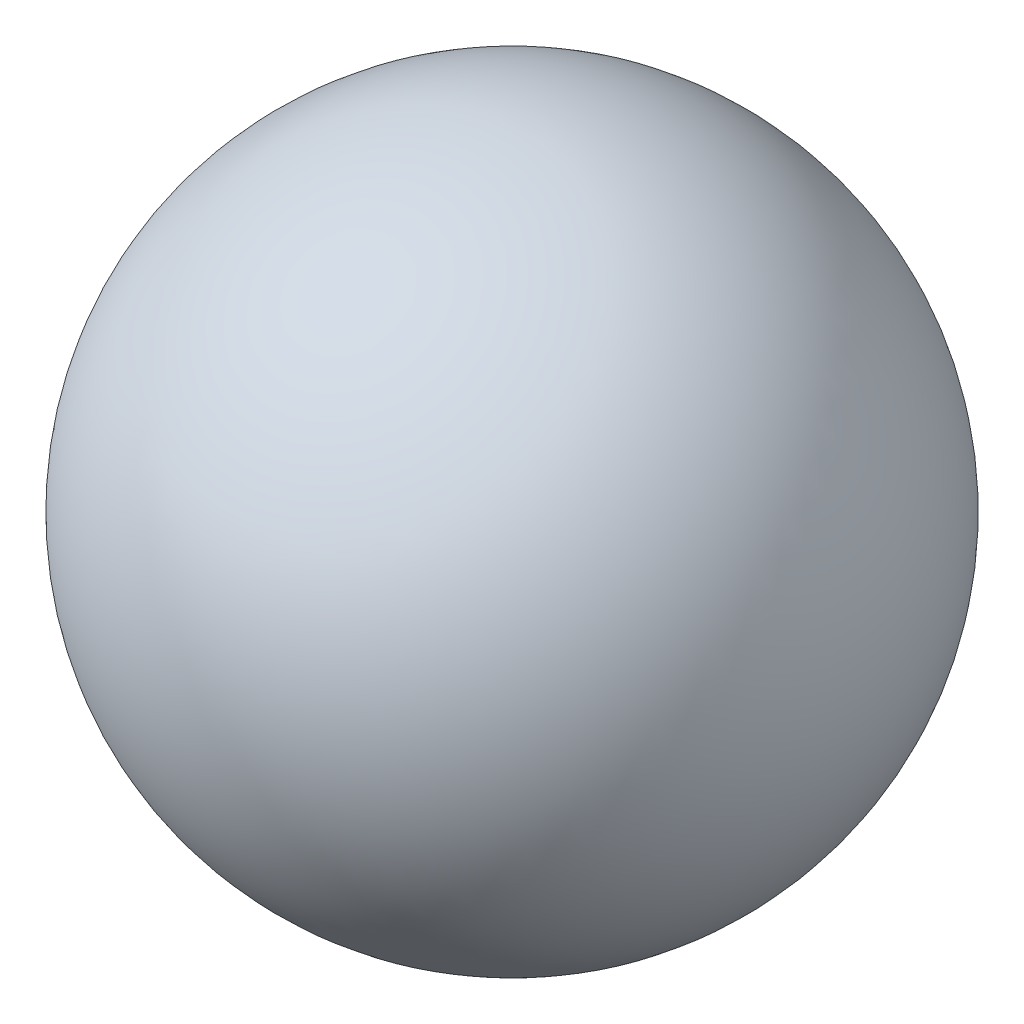
ISO-10303-21;
HEADER;
FILE_DESCRIPTION(('STEP AP214'),'2;1');
FILE_NAME('part.step','',(''),(''),'','','');
FILE_SCHEMA(('AUTOMOTIVE_DESIGN { 1 0 10303 214 1 1 1 1 }'));
ENDSEC;
DATA;
#1=APPLICATION_CONTEXT('core data for automotive mechanical design processes');
#2=APPLICATION_PROTOCOL_DEFINITION('international standard','automotive_design',2000,#1);
#3=PRODUCT_CONTEXT('',#1,'mechanical');
#4=PRODUCT('Part','Part','',(#3));
#5=PRODUCT_RELATED_PRODUCT_CATEGORY('part','',(#4));
#6=PRODUCT_DEFINITION_FORMATION('','',#4);
#7=PRODUCT_DEFINITION_CONTEXT('part definition',#1,'design');
#8=PRODUCT_DEFINITION('design','',#6,#7);
#9=PRODUCT_DEFINITION_SHAPE('','',#8);
#10=(LENGTH_UNIT() NAMED_UNIT(*) SI_UNIT(.MILLI.,.METRE.));
#11=(NAMED_UNIT(*) PLANE_ANGLE_UNIT() SI_UNIT($,.RADIAN.));
#12=(NAMED_UNIT(*) SI_UNIT($,.STERADIAN.) SOLID_ANGLE_UNIT());
#13=UNCERTAINTY_MEASURE_WITH_UNIT(LENGTH_MEASURE(1.E-05),#10,'distance_accuracy_value','');
#14=(GEOMETRIC_REPRESENTATION_CONTEXT(3) GLOBAL_UNCERTAINTY_ASSIGNED_CONTEXT((#13)) GLOBAL_UNIT_ASSIGNED_CONTEXT((#10,
#11,#12)) REPRESENTATION_CONTEXT('',''));
#15=CARTESIAN_POINT('',(0.,0.,0.));
#16=DIRECTION('',(0.,0.,1.));
#17=DIRECTION('',(1.,0.,0.));
#18=AXIS2_PLACEMENT_3D('',#15,#16,#17);
#19=CARTESIAN_POINT('',(0.,0.,0.));
#20=DIRECTION('',(0.,-1.,0.));
#21=DIRECTION('',(0.,0.,1.));
#22=AXIS2_PLACEMENT_3D('',#19,#20,#21);
#23=SPHERICAL_SURFACE('',#22,1.33333333335);
#24=CARTESIAN_POINT('',(0.,-1.33333333335,0.));
#25=VERTEX_POINT('',#24);
#26=VERTEX_LOOP('',#25);
#27=FACE_BOUND('',#26,.T.);
#28=ADVANCED_FACE('F32',(#27),#23,.T.);
#29=CLOSED_SHELL('',(#28));
#30=MANIFOLD_SOLID_BREP('B2',#29);
#31=ADVANCED_BREP_SHAPE_REPRESENTATION('',(#18,#30),#14);
#32=SHAPE_DEFINITION_REPRESENTATION(#9,#31);
ENDSEC;
END-ISO-10303-21;
